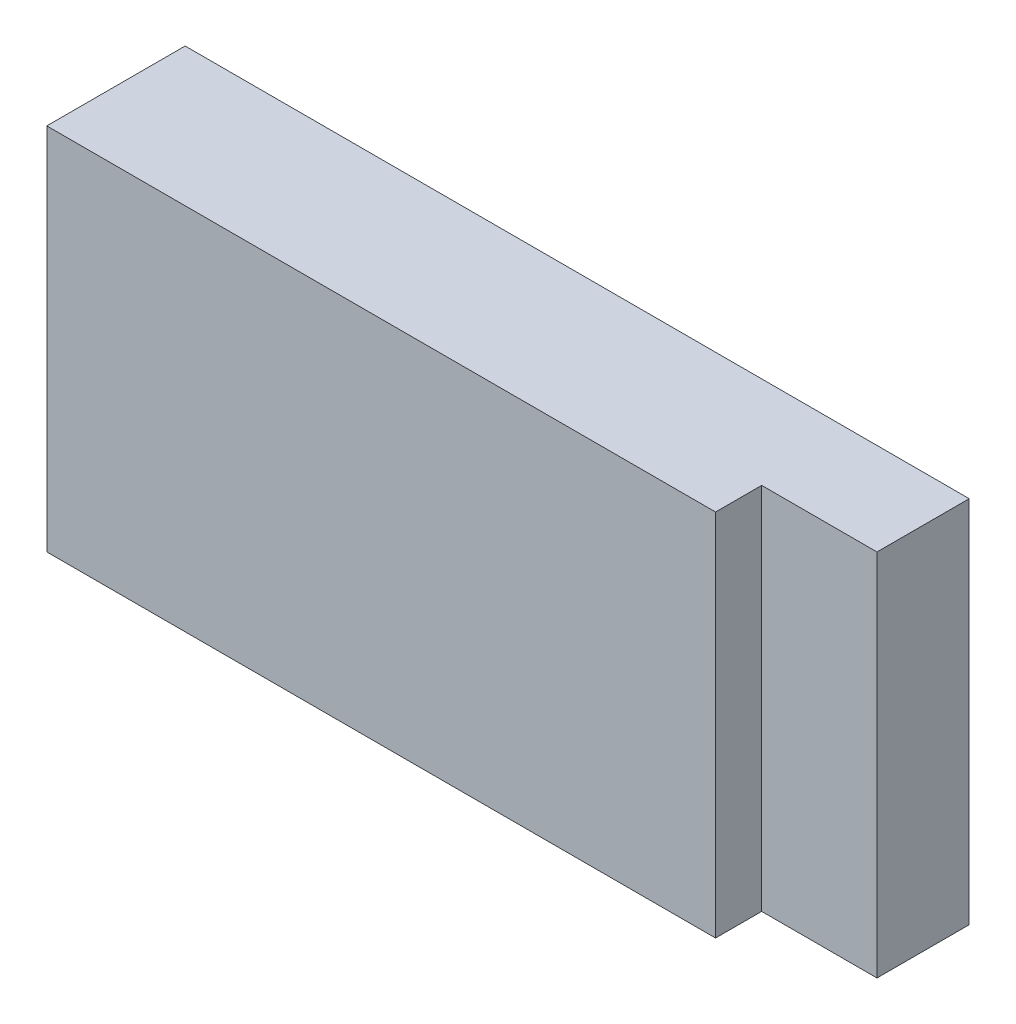
ISO-10303-21;
HEADER;
FILE_DESCRIPTION(('STEP AP214'),'2;1');
FILE_NAME('part.step','',(''),(''),'','','');
FILE_SCHEMA(('AUTOMOTIVE_DESIGN { 1 0 10303 214 1 1 1 1 }'));
ENDSEC;
DATA;
#1=APPLICATION_CONTEXT('core data for automotive mechanical design processes');
#2=APPLICATION_PROTOCOL_DEFINITION('international standard','automotive_design',2000,#1);
#3=PRODUCT_CONTEXT('',#1,'mechanical');
#4=PRODUCT('Part','Part','',(#3));
#5=PRODUCT_RELATED_PRODUCT_CATEGORY('part','',(#4));
#6=PRODUCT_DEFINITION_FORMATION('','',#4);
#7=PRODUCT_DEFINITION_CONTEXT('part definition',#1,'design');
#8=PRODUCT_DEFINITION('design','',#6,#7);
#9=PRODUCT_DEFINITION_SHAPE('','',#8);
#10=(LENGTH_UNIT() NAMED_UNIT(*) SI_UNIT(.MILLI.,.METRE.));
#11=(NAMED_UNIT(*) PLANE_ANGLE_UNIT() SI_UNIT($,.RADIAN.));
#12=(NAMED_UNIT(*) SI_UNIT($,.STERADIAN.) SOLID_ANGLE_UNIT());
#13=UNCERTAINTY_MEASURE_WITH_UNIT(LENGTH_MEASURE(1.E-05),#10,'distance_accuracy_value','');
#14=(GEOMETRIC_REPRESENTATION_CONTEXT(3) GLOBAL_UNCERTAINTY_ASSIGNED_CONTEXT((#13)) GLOBAL_UNIT_ASSIGNED_CONTEXT((#10,
#11,#12)) REPRESENTATION_CONTEXT('',''));
#15=CARTESIAN_POINT('',(0.,0.,0.));
#16=DIRECTION('',(0.,0.,1.));
#17=DIRECTION('',(1.,0.,0.));
#18=AXIS2_PLACEMENT_3D('',#15,#16,#17);
#19=CARTESIAN_POINT('',(0.,0.,4.));
#20=DIRECTION('',(0.,0.,-1.));
#21=DIRECTION('',(-1.,0.,0.));
#22=AXIS2_PLACEMENT_3D('',#19,#20,#21);
#23=PLANE('',#22);
#24=DIRECTION('',(0.,1.,0.));
#25=VECTOR('',#24,1.);
#26=CARTESIAN_POINT('',(15.0636042402827,7.3886925795053,4.));
#27=LINE('',#26,#25);
#28=CARTESIAN_POINT('',(15.0636042402827,-8.61130742049469,4.));
#29=VERTEX_POINT('',#28);
#30=CARTESIAN_POINT('',(15.0636042402827,7.3886925795053,4.));
#31=VERTEX_POINT('',#30);
#32=EDGE_CURVE('E51',#29,#31,#27,.T.);
#33=ORIENTED_EDGE('',*,*,#32,.F.);
#34=DIRECTION('',(1.,0.,0.));
#35=VECTOR('',#34,1.);
#36=CARTESIAN_POINT('',(20.0636042402827,-8.61130742049469,4.));
#37=LINE('',#36,#35);
#38=CARTESIAN_POINT('',(20.0636042402827,-8.61130742049469,4.));
#39=VERTEX_POINT('',#38);
#40=EDGE_CURVE('E89',#29,#39,#37,.T.);
#41=ORIENTED_EDGE('',*,*,#40,.T.);
#42=DIRECTION('',(0.,1.,0.));
#43=VECTOR('',#42,1.);
#44=CARTESIAN_POINT('',(20.0636042402827,7.3886925795053,4.));
#45=LINE('',#44,#43);
#46=CARTESIAN_POINT('',(20.0636042402827,7.3886925795053,4.));
#47=VERTEX_POINT('',#46);
#48=EDGE_CURVE('E57',#39,#47,#45,.T.);
#49=ORIENTED_EDGE('',*,*,#48,.T.);
#50=DIRECTION('',(-1.,0.,0.));
#51=VECTOR('',#50,1.);
#52=CARTESIAN_POINT('',(-13.9363957597173,7.3886925795053,4.));
#53=LINE('',#52,#51);
#54=EDGE_CURVE('E99',#47,#31,#53,.T.);
#55=ORIENTED_EDGE('',*,*,#54,.T.);
#56=EDGE_LOOP('',(#33,#41,#49,#55));
#57=FACE_BOUND('',#56,.T.);
#58=ADVANCED_FACE('F36',(#57),#23,.F.);
#59=CARTESIAN_POINT('',(-13.9363957597173,-8.6113074204947,4.));
#60=DIRECTION('',(1.,0.,0.));
#61=DIRECTION('',(0.,0.,-1.));
#62=AXIS2_PLACEMENT_3D('',#59,#60,#61);
#63=PLANE('',#62);
#64=DIRECTION('',(0.,-1.,0.));
#65=VECTOR('',#64,1.);
#66=CARTESIAN_POINT('',(-13.9363957597173,-8.6113074204947,0.));
#67=LINE('',#66,#65);
#68=CARTESIAN_POINT('',(-13.9363957597173,7.3886925795053,0.));
#69=VERTEX_POINT('',#68);
#70=CARTESIAN_POINT('',(-13.9363957597173,-8.6113074204947,0.));
#71=VERTEX_POINT('',#70);
#72=EDGE_CURVE('E95',#69,#71,#67,.T.);
#73=ORIENTED_EDGE('',*,*,#72,.T.);
#74=DIRECTION('',(0.,0.,-1.));
#75=VECTOR('',#74,1.);
#76=CARTESIAN_POINT('',(-13.9363957597173,-8.6113074204947,4.));
#77=LINE('',#76,#75);
#78=CARTESIAN_POINT('',(-13.9363957597173,-8.6113074204947,6.));
#79=VERTEX_POINT('',#78);
#80=EDGE_CURVE('E11',#79,#71,#77,.T.);
#81=ORIENTED_EDGE('',*,*,#80,.F.);
#82=DIRECTION('',(0.,-1.,0.));
#83=VECTOR('',#82,1.);
#84=CARTESIAN_POINT('',(-13.9363957597173,7.3886925795053,6.));
#85=LINE('',#84,#83);
#86=CARTESIAN_POINT('',(-13.9363957597173,7.3886925795053,6.));
#87=VERTEX_POINT('',#86);
#88=EDGE_CURVE('E97',#87,#79,#85,.T.);
#89=ORIENTED_EDGE('',*,*,#88,.F.);
#90=DIRECTION('',(0.,0.,-1.));
#91=VECTOR('',#90,1.);
#92=CARTESIAN_POINT('',(-13.9363957597173,7.3886925795053,4.));
#93=LINE('',#92,#91);
#94=EDGE_CURVE('E82',#87,#69,#93,.T.);
#95=ORIENTED_EDGE('',*,*,#94,.T.);
#96=EDGE_LOOP('',(#73,#81,#89,#95));
#97=FACE_BOUND('',#96,.T.);
#98=ADVANCED_FACE('F38',(#97),#63,.F.);
#99=CARTESIAN_POINT('',(20.0636042402827,-8.61130742049469,4.));
#100=DIRECTION('',(0.,1.,0.));
#101=DIRECTION('',(-1.,0.,0.));
#102=AXIS2_PLACEMENT_3D('',#99,#100,#101);
#103=PLANE('',#102);
#104=DIRECTION('',(1.,0.,0.));
#105=VECTOR('',#104,1.);
#106=CARTESIAN_POINT('',(20.0636042402827,-8.61130742049469,0.));
#107=LINE('',#106,#105);
#108=CARTESIAN_POINT('',(20.0636042402827,-8.61130742049469,0.));
#109=VERTEX_POINT('',#108);
#110=EDGE_CURVE('E102',#71,#109,#107,.T.);
#111=ORIENTED_EDGE('',*,*,#110,.T.);
#112=DIRECTION('',(0.,0.,-1.));
#113=VECTOR('',#112,1.);
#114=CARTESIAN_POINT('',(20.0636042402827,-8.61130742049469,4.));
#115=LINE('',#114,#113);
#116=EDGE_CURVE('E44',#39,#109,#115,.T.);
#117=ORIENTED_EDGE('',*,*,#116,.F.);
#118=ORIENTED_EDGE('',*,*,#40,.F.);
#119=DIRECTION('',(0.,0.,-1.));
#120=VECTOR('',#119,1.);
#121=CARTESIAN_POINT('',(15.0636042402827,-8.6113074204947,6.));
#122=LINE('',#121,#120);
#123=CARTESIAN_POINT('',(15.0636042402827,-8.6113074204947,6.));
#124=VERTEX_POINT('',#123);
#125=EDGE_CURVE('E103',#124,#29,#122,.T.);
#126=ORIENTED_EDGE('',*,*,#125,.F.);
#127=DIRECTION('',(1.,0.,0.));
#128=VECTOR('',#127,1.);
#129=CARTESIAN_POINT('',(-13.9363957597173,-8.6113074204947,6.));
#130=LINE('',#129,#128);
#131=EDGE_CURVE('E123',#79,#124,#130,.T.);
#132=ORIENTED_EDGE('',*,*,#131,.F.);
#133=ORIENTED_EDGE('',*,*,#80,.T.);
#134=EDGE_LOOP('',(#111,#117,#118,#126,#132,#133));
#135=FACE_BOUND('',#134,.T.);
#136=ADVANCED_FACE('F118',(#135),#103,.F.);
#137=CARTESIAN_POINT('',(20.0636042402827,7.3886925795053,4.));
#138=DIRECTION('',(-1.,0.,0.));
#139=DIRECTION('',(0.,0.,1.));
#140=AXIS2_PLACEMENT_3D('',#137,#138,#139);
#141=PLANE('',#140);
#142=DIRECTION('',(0.,1.,0.));
#143=VECTOR('',#142,1.);
#144=CARTESIAN_POINT('',(20.0636042402827,7.3886925795053,0.));
#145=LINE('',#144,#143);
#146=CARTESIAN_POINT('',(20.0636042402827,7.3886925795053,0.));
#147=VERTEX_POINT('',#146);
#148=EDGE_CURVE('E90',#109,#147,#145,.T.);
#149=ORIENTED_EDGE('',*,*,#148,.T.);
#150=DIRECTION('',(0.,0.,-1.));
#151=VECTOR('',#150,1.);
#152=CARTESIAN_POINT('',(20.0636042402827,7.3886925795053,4.));
#153=LINE('',#152,#151);
#154=EDGE_CURVE('E85',#47,#147,#153,.T.);
#155=ORIENTED_EDGE('',*,*,#154,.F.);
#156=ORIENTED_EDGE('',*,*,#48,.F.);
#157=ORIENTED_EDGE('',*,*,#116,.T.);
#158=EDGE_LOOP('',(#149,#155,#156,#157));
#159=FACE_BOUND('',#158,.T.);
#160=ADVANCED_FACE('F116',(#159),#141,.F.);
#161=CARTESIAN_POINT('',(-13.9363957597173,7.3886925795053,4.));
#162=DIRECTION('',(0.,-1.,0.));
#163=DIRECTION('',(0.,0.,-1.));
#164=AXIS2_PLACEMENT_3D('',#161,#162,#163);
#165=PLANE('',#164);
#166=DIRECTION('',(-1.,0.,0.));
#167=VECTOR('',#166,1.);
#168=CARTESIAN_POINT('',(-13.9363957597173,7.3886925795053,0.));
#169=LINE('',#168,#167);
#170=EDGE_CURVE('E77',#147,#69,#169,.T.);
#171=ORIENTED_EDGE('',*,*,#170,.T.);
#172=ORIENTED_EDGE('',*,*,#94,.F.);
#173=DIRECTION('',(-1.,0.,0.));
#174=VECTOR('',#173,1.);
#175=CARTESIAN_POINT('',(15.0636042402827,7.3886925795053,6.));
#176=LINE('',#175,#174);
#177=CARTESIAN_POINT('',(15.0636042402827,7.3886925795053,6.));
#178=VERTEX_POINT('',#177);
#179=EDGE_CURVE('E129',#178,#87,#176,.T.);
#180=ORIENTED_EDGE('',*,*,#179,.F.);
#181=DIRECTION('',(0.,0.,-1.));
#182=VECTOR('',#181,1.);
#183=CARTESIAN_POINT('',(15.0636042402827,7.3886925795053,6.));
#184=LINE('',#183,#182);
#185=EDGE_CURVE('E107',#178,#31,#184,.T.);
#186=ORIENTED_EDGE('',*,*,#185,.T.);
#187=ORIENTED_EDGE('',*,*,#54,.F.);
#188=ORIENTED_EDGE('',*,*,#154,.T.);
#189=EDGE_LOOP('',(#171,#172,#180,#186,#187,#188));
#190=FACE_BOUND('',#189,.T.);
#191=ADVANCED_FACE('F79',(#190),#165,.F.);
#192=CARTESIAN_POINT('',(0.,0.,0.));
#193=DIRECTION('',(0.,0.,-1.));
#194=DIRECTION('',(-1.,0.,0.));
#195=AXIS2_PLACEMENT_3D('',#192,#193,#194);
#196=PLANE('',#195);
#197=ORIENTED_EDGE('',*,*,#72,.F.);
#198=ORIENTED_EDGE('',*,*,#170,.F.);
#199=ORIENTED_EDGE('',*,*,#148,.F.);
#200=ORIENTED_EDGE('',*,*,#110,.F.);
#201=EDGE_LOOP('',(#197,#198,#199,#200));
#202=FACE_BOUND('',#201,.T.);
#203=ADVANCED_FACE('F101',(#202),#196,.T.);
#204=CARTESIAN_POINT('',(15.0636042402827,7.3886925795053,6.));
#205=DIRECTION('',(-1.,0.,0.));
#206=DIRECTION('',(0.,-1.,0.));
#207=AXIS2_PLACEMENT_3D('',#204,#205,#206);
#208=PLANE('',#207);
#209=ORIENTED_EDGE('',*,*,#32,.T.);
#210=ORIENTED_EDGE('',*,*,#185,.F.);
#211=DIRECTION('',(0.,1.,0.));
#212=VECTOR('',#211,1.);
#213=CARTESIAN_POINT('',(15.0636042402827,7.3886925795053,6.));
#214=LINE('',#213,#212);
#215=EDGE_CURVE('E131',#124,#178,#214,.T.);
#216=ORIENTED_EDGE('',*,*,#215,.F.);
#217=ORIENTED_EDGE('',*,*,#125,.T.);
#218=EDGE_LOOP('',(#209,#210,#216,#217));
#219=FACE_BOUND('',#218,.T.);
#220=ADVANCED_FACE('F142',(#219),#208,.F.);
#221=CARTESIAN_POINT('',(0.,0.,6.));
#222=DIRECTION('',(0.,0.,1.));
#223=DIRECTION('',(1.,0.,0.));
#224=AXIS2_PLACEMENT_3D('',#221,#222,#223);
#225=PLANE('',#224);
#226=ORIENTED_EDGE('',*,*,#179,.T.);
#227=ORIENTED_EDGE('',*,*,#88,.T.);
#228=ORIENTED_EDGE('',*,*,#131,.T.);
#229=ORIENTED_EDGE('',*,*,#215,.T.);
#230=EDGE_LOOP('',(#226,#227,#228,#229));
#231=FACE_BOUND('',#230,.T.);
#232=ADVANCED_FACE('F127',(#231),#225,.T.);
#233=CLOSED_SHELL('',(#58,#98,#136,#160,#191,#203,#220,#232));
#234=MANIFOLD_SOLID_BREP('B2',#233);
#235=ADVANCED_BREP_SHAPE_REPRESENTATION('',(#18,#234),#14);
#236=SHAPE_DEFINITION_REPRESENTATION(#9,#235);
ENDSEC;
END-ISO-10303-21;
